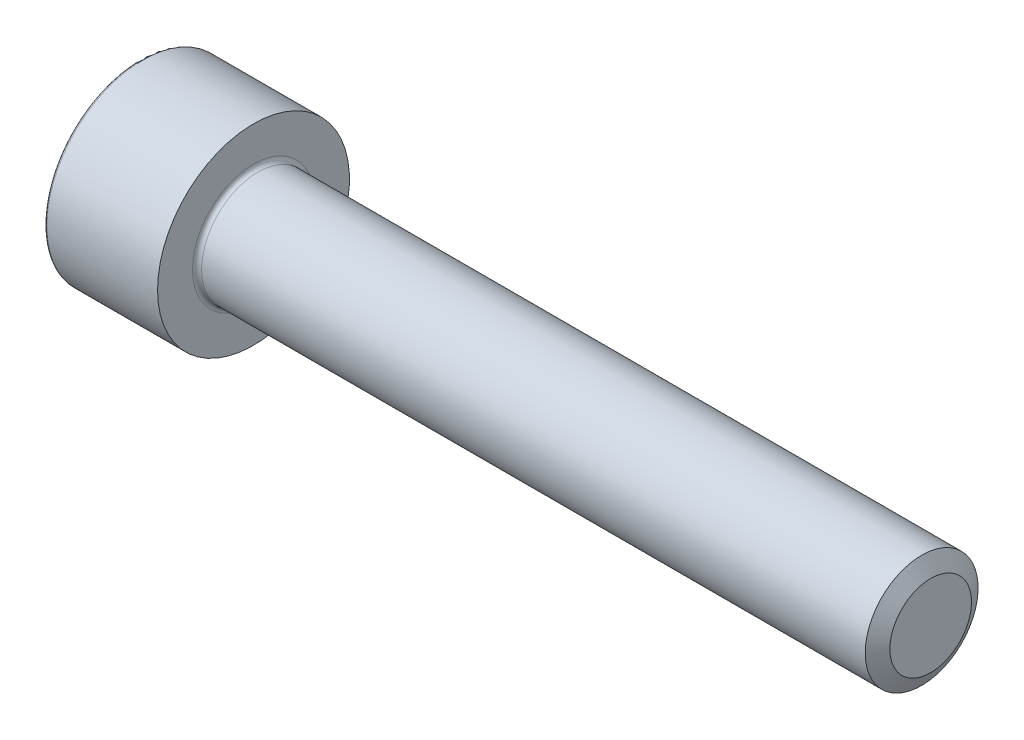
ISO-10303-21;
HEADER;
FILE_DESCRIPTION(('STEP AP214'),'2;1');
FILE_NAME('part.step','',(''),(''),'','','');
FILE_SCHEMA(('AUTOMOTIVE_DESIGN { 1 0 10303 214 1 1 1 1 }'));
ENDSEC;
DATA;
#1=APPLICATION_CONTEXT('core data for automotive mechanical design processes');
#2=APPLICATION_PROTOCOL_DEFINITION('international standard','automotive_design',2000,#1);
#3=PRODUCT_CONTEXT('',#1,'mechanical');
#4=PRODUCT('Part','Part','',(#3));
#5=PRODUCT_RELATED_PRODUCT_CATEGORY('part','',(#4));
#6=PRODUCT_DEFINITION_FORMATION('','',#4);
#7=PRODUCT_DEFINITION_CONTEXT('part definition',#1,'design');
#8=PRODUCT_DEFINITION('design','',#6,#7);
#9=PRODUCT_DEFINITION_SHAPE('','',#8);
#10=(LENGTH_UNIT() NAMED_UNIT(*) SI_UNIT(.MILLI.,.METRE.));
#11=(NAMED_UNIT(*) PLANE_ANGLE_UNIT() SI_UNIT($,.RADIAN.));
#12=(NAMED_UNIT(*) SI_UNIT($,.STERADIAN.) SOLID_ANGLE_UNIT());
#13=UNCERTAINTY_MEASURE_WITH_UNIT(LENGTH_MEASURE(1.E-05),#10,'distance_accuracy_value','');
#14=(GEOMETRIC_REPRESENTATION_CONTEXT(3) GLOBAL_UNCERTAINTY_ASSIGNED_CONTEXT((#13)) GLOBAL_UNIT_ASSIGNED_CONTEXT((#10,
#11,#12)) REPRESENTATION_CONTEXT('',''));
#15=CARTESIAN_POINT('',(0.,0.,0.));
#16=DIRECTION('',(0.,0.,1.));
#17=DIRECTION('',(1.,0.,0.));
#18=AXIS2_PLACEMENT_3D('',#15,#16,#17);
#19=CARTESIAN_POINT('',(0.,0.,0.));
#20=DIRECTION('',(-1.,0.,0.));
#21=DIRECTION('',(0.,0.,1.));
#22=AXIS2_PLACEMENT_3D('',#19,#20,#21);
#23=CYLINDRICAL_SURFACE('',#22,2.5);
#24=CARTESIAN_POINT('',(5.2,0.,0.));
#25=DIRECTION('',(-1.,0.,0.));
#26=DIRECTION('',(0.,0.,1.));
#27=AXIS2_PLACEMENT_3D('',#24,#25,#26);
#28=CIRCLE('',#27,2.5);
#29=CARTESIAN_POINT('',(5.2,0.,2.5));
#30=VERTEX_POINT('',#29);
#31=EDGE_CURVE('E159',#30,#30,#28,.T.);
#32=ORIENTED_EDGE('',*,*,#31,.F.);
#33=EDGE_LOOP('',(#32));
#34=FACE_BOUND('',#33,.T.);
#35=CARTESIAN_POINT('',(34.6000117335054,0.,0.));
#36=DIRECTION('',(-1.,0.,0.));
#37=DIRECTION('',(0.,0.,1.));
#38=AXIS2_PLACEMENT_3D('',#35,#36,#37);
#39=CIRCLE('',#38,2.5);
#40=CARTESIAN_POINT('',(34.6000117335054,0.,2.5));
#41=VERTEX_POINT('',#40);
#42=EDGE_CURVE('E293',#41,#41,#39,.T.);
#43=ORIENTED_EDGE('',*,*,#42,.T.);
#44=EDGE_LOOP('',(#43));
#45=FACE_BOUND('',#44,.T.);
#46=ADVANCED_FACE('F42',(#34,#45),#23,.T.);
#47=CARTESIAN_POINT('',(0.,0.,0.));
#48=DIRECTION('',(1.,0.,0.));
#49=DIRECTION('',(0.,0.,-1.));
#50=AXIS2_PLACEMENT_3D('',#47,#48,#49);
#51=PLANE('',#50);
#52=CARTESIAN_POINT('',(0.,0.,0.));
#53=DIRECTION('',(1.,0.,0.));
#54=DIRECTION('',(0.,0.,-1.));
#55=AXIS2_PLACEMENT_3D('',#52,#53,#54);
#56=CIRCLE('',#55,4.15);
#57=CARTESIAN_POINT('',(0.,0.,-4.15));
#58=VERTEX_POINT('',#57);
#59=EDGE_CURVE('E51',#58,#58,#56,.F.);
#60=ORIENTED_EDGE('',*,*,#59,.T.);
#61=EDGE_LOOP('',(#60));
#62=FACE_BOUND('',#61,.T.);
#63=DIRECTION('',(0.,0.866025403784439,-0.5));
#64=VECTOR('',#63,1.);
#65=CARTESIAN_POINT('',(0.,0.,2.29));
#66=LINE('',#65,#64);
#67=CARTESIAN_POINT('',(0.,0.,2.29));
#68=VERTEX_POINT('',#67);
#69=CARTESIAN_POINT('',(0.,1.98319817466637,1.145));
#70=VERTEX_POINT('',#69);
#71=EDGE_CURVE('E139',#68,#70,#66,.T.);
#72=ORIENTED_EDGE('',*,*,#71,.F.);
#73=DIRECTION('',(0.,0.866025403784439,0.5));
#74=VECTOR('',#73,1.);
#75=CARTESIAN_POINT('',(0.,-1.98319817466637,1.145));
#76=LINE('',#75,#74);
#77=CARTESIAN_POINT('',(0.,-1.98319817466637,1.145));
#78=VERTEX_POINT('',#77);
#79=EDGE_CURVE('E58',#78,#68,#76,.T.);
#80=ORIENTED_EDGE('',*,*,#79,.F.);
#81=DIRECTION('',(0.,0.,1.));
#82=VECTOR('',#81,1.);
#83=CARTESIAN_POINT('',(0.,-1.98319817466636,-1.145));
#84=LINE('',#83,#82);
#85=CARTESIAN_POINT('',(0.,-1.98319817466636,-1.145));
#86=VERTEX_POINT('',#85);
#87=EDGE_CURVE('E153',#86,#78,#84,.T.);
#88=ORIENTED_EDGE('',*,*,#87,.F.);
#89=DIRECTION('',(0.,-0.866025403784438,0.5));
#90=VECTOR('',#89,1.);
#91=CARTESIAN_POINT('',(0.,0.,-2.29));
#92=LINE('',#91,#90);
#93=CARTESIAN_POINT('',(0.,0.,-2.29));
#94=VERTEX_POINT('',#93);
#95=EDGE_CURVE('E150',#94,#86,#92,.T.);
#96=ORIENTED_EDGE('',*,*,#95,.F.);
#97=DIRECTION('',(0.,-0.866025403784439,-0.5));
#98=VECTOR('',#97,1.);
#99=CARTESIAN_POINT('',(0.,1.98319817466636,-1.145));
#100=LINE('',#99,#98);
#101=CARTESIAN_POINT('',(0.,1.98319817466636,-1.145));
#102=VERTEX_POINT('',#101);
#103=EDGE_CURVE('E106',#102,#94,#100,.T.);
#104=ORIENTED_EDGE('',*,*,#103,.F.);
#105=DIRECTION('',(0.,0.,-1.));
#106=VECTOR('',#105,1.);
#107=CARTESIAN_POINT('',(0.,1.98319817466637,1.145));
#108=LINE('',#107,#106);
#109=EDGE_CURVE('E144',#70,#102,#108,.T.);
#110=ORIENTED_EDGE('',*,*,#109,.F.);
#111=EDGE_LOOP('',(#72,#80,#88,#96,#104,#110));
#112=FACE_BOUND('',#111,.T.);
#113=ADVANCED_FACE('F183',(#62,#112),#51,.F.);
#114=CARTESIAN_POINT('',(0.,0.,0.));
#115=DIRECTION('',(-1.,0.,0.));
#116=DIRECTION('',(0.,0.,1.));
#117=AXIS2_PLACEMENT_3D('',#114,#115,#116);
#118=CYLINDRICAL_SURFACE('',#117,4.25);
#119=CARTESIAN_POINT('',(0.1,0.,0.));
#120=DIRECTION('',(1.,0.,0.));
#121=DIRECTION('',(0.,0.,-1.));
#122=AXIS2_PLACEMENT_3D('',#119,#120,#121);
#123=CIRCLE('',#122,4.25);
#124=CARTESIAN_POINT('',(0.1,0.,-4.25));
#125=VERTEX_POINT('',#124);
#126=EDGE_CURVE('E11',#125,#125,#123,.T.);
#127=ORIENTED_EDGE('',*,*,#126,.T.);
#128=EDGE_LOOP('',(#127));
#129=FACE_BOUND('',#128,.T.);
#130=CARTESIAN_POINT('',(5.,0.,0.));
#131=DIRECTION('',(-1.,0.,0.));
#132=DIRECTION('',(0.,0.,1.));
#133=AXIS2_PLACEMENT_3D('',#130,#131,#132);
#134=CIRCLE('',#133,4.25);
#135=CARTESIAN_POINT('',(5.,0.,4.25));
#136=VERTEX_POINT('',#135);
#137=EDGE_CURVE('E175',#136,#136,#134,.T.);
#138=ORIENTED_EDGE('',*,*,#137,.T.);
#139=EDGE_LOOP('',(#138));
#140=FACE_BOUND('',#139,.T.);
#141=ADVANCED_FACE('F202',(#129,#140),#118,.T.);
#142=CARTESIAN_POINT('',(5.,4.25,0.));
#143=DIRECTION('',(-1.,0.,0.));
#144=DIRECTION('',(0.,0.,1.));
#145=AXIS2_PLACEMENT_3D('',#142,#143,#144);
#146=PLANE('',#145);
#147=ORIENTED_EDGE('',*,*,#137,.F.);
#148=EDGE_LOOP('',(#147));
#149=FACE_BOUND('',#148,.T.);
#150=CARTESIAN_POINT('',(5.,0.,0.));
#151=DIRECTION('',(-1.,0.,0.));
#152=DIRECTION('',(0.,0.,1.));
#153=AXIS2_PLACEMENT_3D('',#150,#151,#152);
#154=CIRCLE('',#153,2.7);
#155=CARTESIAN_POINT('',(5.,0.,2.7));
#156=VERTEX_POINT('',#155);
#157=EDGE_CURVE('E171',#156,#156,#154,.T.);
#158=ORIENTED_EDGE('',*,*,#157,.T.);
#159=EDGE_LOOP('',(#158));
#160=FACE_BOUND('',#159,.T.);
#161=ADVANCED_FACE('F211',(#149,#160),#146,.F.);
#162=CARTESIAN_POINT('',(5.2,0.,0.));
#163=DIRECTION('',(-1.,0.,0.));
#164=DIRECTION('',(0.,0.,1.));
#165=AXIS2_PLACEMENT_3D('',#162,#163,#164);
#166=TOROIDAL_SURFACE('',#165,2.7,0.2);
#167=ORIENTED_EDGE('',*,*,#157,.F.);
#168=EDGE_LOOP('',(#167));
#169=FACE_BOUND('',#168,.T.);
#170=ORIENTED_EDGE('',*,*,#31,.T.);
#171=EDGE_LOOP('',(#170));
#172=FACE_BOUND('',#171,.T.);
#173=ADVANCED_FACE('F207',(#169,#172),#166,.F.);
#174=CARTESIAN_POINT('',(2.5,-1.98319817466637,1.145));
#175=DIRECTION('',(0.,-0.5,0.866025403784439));
#176=DIRECTION('',(0.,-0.866025403784439,-0.5));
#177=AXIS2_PLACEMENT_3D('',#174,#175,#176);
#178=PLANE('',#177);
#179=ORIENTED_EDGE('',*,*,#79,.T.);
#180=DIRECTION('',(-1.,0.,0.));
#181=VECTOR('',#180,1.);
#182=CARTESIAN_POINT('',(2.5,0.,2.29));
#183=LINE('',#182,#181);
#184=CARTESIAN_POINT('',(2.5,0.,2.29));
#185=VERTEX_POINT('',#184);
#186=EDGE_CURVE('E88',#185,#68,#183,.T.);
#187=ORIENTED_EDGE('',*,*,#186,.F.);
#188=DIRECTION('',(0.,0.866025403784439,0.5));
#189=VECTOR('',#188,1.);
#190=CARTESIAN_POINT('',(2.5,-1.98319817466637,1.145));
#191=LINE('',#190,#189);
#192=CARTESIAN_POINT('',(2.5,-1.98319817466637,1.145));
#193=VERTEX_POINT('',#192);
#194=EDGE_CURVE('E156',#193,#185,#191,.T.);
#195=ORIENTED_EDGE('',*,*,#194,.F.);
#196=DIRECTION('',(-1.,0.,0.));
#197=VECTOR('',#196,1.);
#198=CARTESIAN_POINT('',(2.5,-1.98319817466637,1.145));
#199=LINE('',#198,#197);
#200=EDGE_CURVE('E66',#193,#78,#199,.T.);
#201=ORIENTED_EDGE('',*,*,#200,.T.);
#202=EDGE_LOOP('',(#179,#187,#195,#201));
#203=FACE_BOUND('',#202,.T.);
#204=ADVANCED_FACE('F210',(#203),#178,.F.);
#205=CARTESIAN_POINT('',(2.5,-1.98319817466636,-1.145));
#206=DIRECTION('',(0.,-1.,0.));
#207=DIRECTION('',(0.,0.,-1.));
#208=AXIS2_PLACEMENT_3D('',#205,#206,#207);
#209=PLANE('',#208);
#210=ORIENTED_EDGE('',*,*,#87,.T.);
#211=ORIENTED_EDGE('',*,*,#200,.F.);
#212=DIRECTION('',(0.,0.,1.));
#213=VECTOR('',#212,1.);
#214=CARTESIAN_POINT('',(2.5,-1.98319817466636,-1.145));
#215=LINE('',#214,#213);
#216=CARTESIAN_POINT('',(2.5,-1.98319817466636,-1.145));
#217=VERTEX_POINT('',#216);
#218=EDGE_CURVE('E120',#217,#193,#215,.T.);
#219=ORIENTED_EDGE('',*,*,#218,.F.);
#220=DIRECTION('',(-1.,0.,0.));
#221=VECTOR('',#220,1.);
#222=CARTESIAN_POINT('',(2.5,-1.98319817466636,-1.145));
#223=LINE('',#222,#221);
#224=EDGE_CURVE('E111',#217,#86,#223,.T.);
#225=ORIENTED_EDGE('',*,*,#224,.T.);
#226=EDGE_LOOP('',(#210,#211,#219,#225));
#227=FACE_BOUND('',#226,.T.);
#228=ADVANCED_FACE('F239',(#227),#209,.F.);
#229=CARTESIAN_POINT('',(2.5,0.,-2.29));
#230=DIRECTION('',(0.,-0.5,-0.866025403784439));
#231=DIRECTION('',(0.,0.866025403784439,-0.5));
#232=AXIS2_PLACEMENT_3D('',#229,#230,#231);
#233=PLANE('',#232);
#234=ORIENTED_EDGE('',*,*,#95,.T.);
#235=ORIENTED_EDGE('',*,*,#224,.F.);
#236=DIRECTION('',(0.,-0.866025403784438,0.5));
#237=VECTOR('',#236,1.);
#238=CARTESIAN_POINT('',(2.5,0.,-2.29));
#239=LINE('',#238,#237);
#240=CARTESIAN_POINT('',(2.5,0.,-2.29));
#241=VERTEX_POINT('',#240);
#242=EDGE_CURVE('E115',#241,#217,#239,.T.);
#243=ORIENTED_EDGE('',*,*,#242,.F.);
#244=DIRECTION('',(-1.,0.,0.));
#245=VECTOR('',#244,1.);
#246=CARTESIAN_POINT('',(2.5,0.,-2.29));
#247=LINE('',#246,#245);
#248=EDGE_CURVE('E99',#241,#94,#247,.T.);
#249=ORIENTED_EDGE('',*,*,#248,.T.);
#250=EDGE_LOOP('',(#234,#235,#243,#249));
#251=FACE_BOUND('',#250,.T.);
#252=ADVANCED_FACE('F116',(#251),#233,.F.);
#253=CARTESIAN_POINT('',(2.5,1.98319817466636,-1.145));
#254=DIRECTION('',(0.,0.5,-0.866025403784439));
#255=DIRECTION('',(0.,0.866025403784439,0.5));
#256=AXIS2_PLACEMENT_3D('',#253,#254,#255);
#257=PLANE('',#256);
#258=ORIENTED_EDGE('',*,*,#103,.T.);
#259=ORIENTED_EDGE('',*,*,#248,.F.);
#260=DIRECTION('',(0.,-0.866025403784439,-0.5));
#261=VECTOR('',#260,1.);
#262=CARTESIAN_POINT('',(2.5,1.98319817466636,-1.145));
#263=LINE('',#262,#261);
#264=CARTESIAN_POINT('',(2.5,1.98319817466636,-1.145));
#265=VERTEX_POINT('',#264);
#266=EDGE_CURVE('E103',#265,#241,#263,.T.);
#267=ORIENTED_EDGE('',*,*,#266,.F.);
#268=DIRECTION('',(-1.,0.,0.));
#269=VECTOR('',#268,1.);
#270=CARTESIAN_POINT('',(2.5,1.98319817466636,-1.145));
#271=LINE('',#270,#269);
#272=EDGE_CURVE('E112',#265,#102,#271,.T.);
#273=ORIENTED_EDGE('',*,*,#272,.T.);
#274=EDGE_LOOP('',(#258,#259,#267,#273));
#275=FACE_BOUND('',#274,.T.);
#276=ADVANCED_FACE('F101',(#275),#257,.F.);
#277=CARTESIAN_POINT('',(2.5,1.98319817466637,1.145));
#278=DIRECTION('',(0.,1.,0.));
#279=DIRECTION('',(0.,0.,1.));
#280=AXIS2_PLACEMENT_3D('',#277,#278,#279);
#281=PLANE('',#280);
#282=ORIENTED_EDGE('',*,*,#109,.T.);
#283=ORIENTED_EDGE('',*,*,#272,.F.);
#284=DIRECTION('',(0.,0.,-1.));
#285=VECTOR('',#284,1.);
#286=CARTESIAN_POINT('',(2.5,1.98319817466637,1.145));
#287=LINE('',#286,#285);
#288=CARTESIAN_POINT('',(2.5,1.98319817466637,1.145));
#289=VERTEX_POINT('',#288);
#290=EDGE_CURVE('E126',#289,#265,#287,.T.);
#291=ORIENTED_EDGE('',*,*,#290,.F.);
#292=DIRECTION('',(-1.,0.,0.));
#293=VECTOR('',#292,1.);
#294=CARTESIAN_POINT('',(2.5,1.98319817466637,1.145));
#295=LINE('',#294,#293);
#296=EDGE_CURVE('E163',#289,#70,#295,.T.);
#297=ORIENTED_EDGE('',*,*,#296,.T.);
#298=EDGE_LOOP('',(#282,#283,#291,#297));
#299=FACE_BOUND('',#298,.T.);
#300=ADVANCED_FACE('F254',(#299),#281,.F.);
#301=CARTESIAN_POINT('',(2.5,0.,2.29));
#302=DIRECTION('',(0.,0.5,0.866025403784438));
#303=DIRECTION('',(0.,-0.866025403784438,0.5));
#304=AXIS2_PLACEMENT_3D('',#301,#302,#303);
#305=PLANE('',#304);
#306=ORIENTED_EDGE('',*,*,#71,.T.);
#307=ORIENTED_EDGE('',*,*,#296,.F.);
#308=DIRECTION('',(0.,0.866025403784439,-0.5));
#309=VECTOR('',#308,1.);
#310=CARTESIAN_POINT('',(2.5,0.,2.29));
#311=LINE('',#310,#309);
#312=EDGE_CURVE('E131',#185,#289,#311,.T.);
#313=ORIENTED_EDGE('',*,*,#312,.F.);
#314=ORIENTED_EDGE('',*,*,#186,.T.);
#315=EDGE_LOOP('',(#306,#307,#313,#314));
#316=FACE_BOUND('',#315,.T.);
#317=ADVANCED_FACE('F260',(#316),#305,.F.);
#318=CARTESIAN_POINT('',(2.5,-1.98319817466637,1.145));
#319=DIRECTION('',(1.,0.,0.));
#320=DIRECTION('',(0.,0.,-1.));
#321=AXIS2_PLACEMENT_3D('',#318,#319,#320);
#322=PLANE('',#321);
#323=ORIENTED_EDGE('',*,*,#194,.T.);
#324=ORIENTED_EDGE('',*,*,#312,.T.);
#325=ORIENTED_EDGE('',*,*,#290,.T.);
#326=ORIENTED_EDGE('',*,*,#266,.T.);
#327=ORIENTED_EDGE('',*,*,#242,.T.);
#328=ORIENTED_EDGE('',*,*,#218,.T.);
#329=EDGE_LOOP('',(#323,#324,#325,#326,#327,#328));
#330=FACE_BOUND('',#329,.T.);
#331=ADVANCED_FACE('F123',(#330),#322,.F.);
#332=CARTESIAN_POINT('',(34.6000117335054,0.,0.));
#333=DIRECTION('',(-1.,0.,0.));
#334=DIRECTION('',(0.,0.,1.));
#335=AXIS2_PLACEMENT_3D('',#332,#333,#334);
#336=CONICAL_SURFACE('',#335,2.5,1.04719755119658);
#337=CARTESIAN_POINT('',(35.,0.,0.));
#338=DIRECTION('',(-1.,0.,0.));
#339=DIRECTION('',(0.,0.,1.));
#340=AXIS2_PLACEMENT_3D('',#337,#338,#339);
#341=CIRCLE('',#340,1.8072);
#342=CARTESIAN_POINT('',(35.,0.,1.8072));
#343=VERTEX_POINT('',#342);
#344=EDGE_CURVE('E140',#343,#343,#341,.T.);
#345=ORIENTED_EDGE('',*,*,#344,.T.);
#346=EDGE_LOOP('',(#345));
#347=FACE_BOUND('',#346,.T.);
#348=ORIENTED_EDGE('',*,*,#42,.F.);
#349=EDGE_LOOP('',(#348));
#350=FACE_BOUND('',#349,.T.);
#351=ADVANCED_FACE('F192',(#347,#350),#336,.T.);
#352=CARTESIAN_POINT('',(35.,2.5,0.));
#353=DIRECTION('',(-1.,0.,0.));
#354=DIRECTION('',(0.,0.,1.));
#355=AXIS2_PLACEMENT_3D('',#352,#353,#354);
#356=PLANE('',#355);
#357=ORIENTED_EDGE('',*,*,#344,.F.);
#358=EDGE_LOOP('',(#357));
#359=FACE_BOUND('',#358,.T.);
#360=ADVANCED_FACE('F187',(#359),#356,.F.);
#361=CARTESIAN_POINT('',(0.1,0.,0.));
#362=DIRECTION('',(1.,0.,0.));
#363=DIRECTION('',(0.,0.,-1.));
#364=AXIS2_PLACEMENT_3D('',#361,#362,#363);
#365=TOROIDAL_SURFACE('',#364,4.15,0.1);
#366=ORIENTED_EDGE('',*,*,#126,.F.);
#367=EDGE_LOOP('',(#366));
#368=FACE_BOUND('',#367,.T.);
#369=ORIENTED_EDGE('',*,*,#59,.F.);
#370=EDGE_LOOP('',(#369));
#371=FACE_BOUND('',#370,.T.);
#372=ADVANCED_FACE('F44',(#368,#371),#365,.T.);
#373=CLOSED_SHELL('',(#46,#113,#141,#161,#173,#204,#228,#252,#276,#300,#317,#331,#351,#360,#372));
#374=MANIFOLD_SOLID_BREP('B2',#373);
#375=ADVANCED_BREP_SHAPE_REPRESENTATION('',(#18,#374),#14);
#376=SHAPE_DEFINITION_REPRESENTATION(#9,#375);
ENDSEC;
END-ISO-10303-21;
